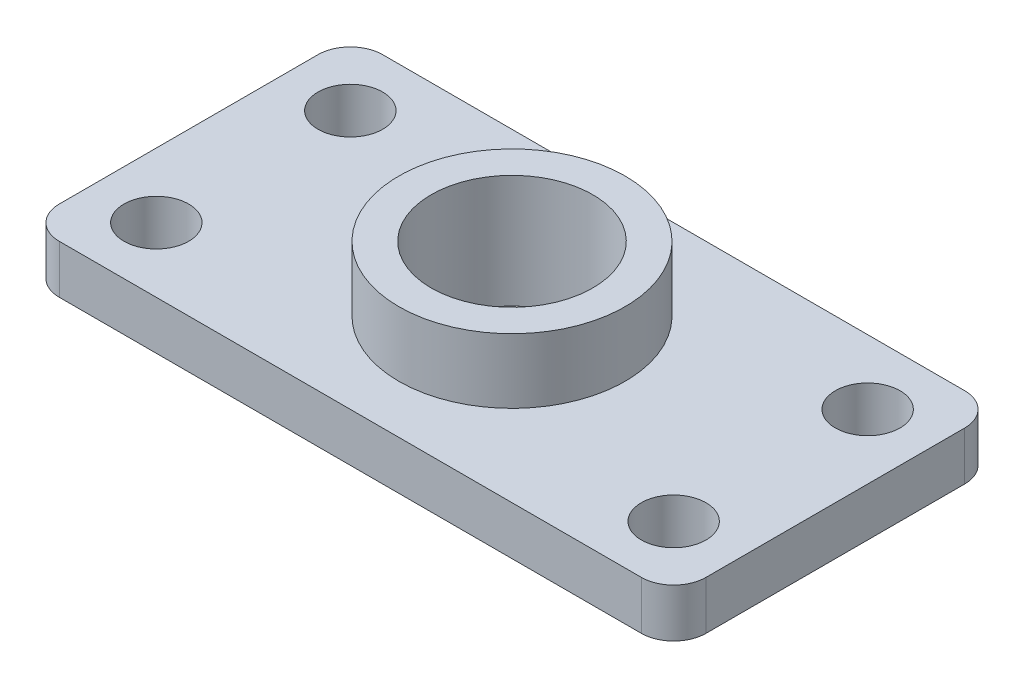
ISO-10303-21;
HEADER;
FILE_DESCRIPTION(('STEP AP214'),'2;1');
FILE_NAME('part.step','',(''),(''),'','','');
FILE_SCHEMA(('AUTOMOTIVE_DESIGN { 1 0 10303 214 1 1 1 1 }'));
ENDSEC;
DATA;
#1=APPLICATION_CONTEXT('core data for automotive mechanical design processes');
#2=APPLICATION_PROTOCOL_DEFINITION('international standard','automotive_design',2000,#1);
#3=PRODUCT_CONTEXT('',#1,'mechanical');
#4=PRODUCT('Part','Part','',(#3));
#5=PRODUCT_RELATED_PRODUCT_CATEGORY('part','',(#4));
#6=PRODUCT_DEFINITION_FORMATION('','',#4);
#7=PRODUCT_DEFINITION_CONTEXT('part definition',#1,'design');
#8=PRODUCT_DEFINITION('design','',#6,#7);
#9=PRODUCT_DEFINITION_SHAPE('','',#8);
#10=(LENGTH_UNIT() NAMED_UNIT(*) SI_UNIT(.MILLI.,.METRE.));
#11=(NAMED_UNIT(*) PLANE_ANGLE_UNIT() SI_UNIT($,.RADIAN.));
#12=(NAMED_UNIT(*) SI_UNIT($,.STERADIAN.) SOLID_ANGLE_UNIT());
#13=UNCERTAINTY_MEASURE_WITH_UNIT(LENGTH_MEASURE(1.E-05),#10,'distance_accuracy_value','');
#14=(GEOMETRIC_REPRESENTATION_CONTEXT(3) GLOBAL_UNCERTAINTY_ASSIGNED_CONTEXT((#13)) GLOBAL_UNIT_ASSIGNED_CONTEXT((#10,
#11,#12)) REPRESENTATION_CONTEXT('',''));
#15=CARTESIAN_POINT('',(0.,0.,0.));
#16=DIRECTION('',(0.,0.,1.));
#17=DIRECTION('',(1.,0.,0.));
#18=AXIS2_PLACEMENT_3D('',#15,#16,#17);
#19=CARTESIAN_POINT('',(0.,15.,0.));
#20=DIRECTION('',(0.,0.,-1.));
#21=DIRECTION('',(-1.,0.,0.));
#22=AXIS2_PLACEMENT_3D('',#19,#20,#21);
#23=PLANE('',#22);
#24=DIRECTION('',(1.,0.,0.));
#25=VECTOR('',#24,1.);
#26=CARTESIAN_POINT('',(0.,0.,0.));
#27=LINE('',#26,#25);
#28=CARTESIAN_POINT('',(10.,0.,0.));
#29=VERTEX_POINT('',#28);
#30=CARTESIAN_POINT('',(190.,0.,0.));
#31=VERTEX_POINT('',#30);
#32=EDGE_CURVE('E184',#29,#31,#27,.T.);
#33=ORIENTED_EDGE('',*,*,#32,.T.);
#34=DIRECTION('',(0.,-1.,0.));
#35=VECTOR('',#34,1.);
#36=CARTESIAN_POINT('',(190.,15.,0.));
#37=LINE('',#36,#35);
#38=CARTESIAN_POINT('',(190.,15.,0.));
#39=VERTEX_POINT('',#38);
#40=EDGE_CURVE('E173',#31,#39,#37,.F.);
#41=ORIENTED_EDGE('',*,*,#40,.T.);
#42=DIRECTION('',(1.,0.,0.));
#43=VECTOR('',#42,1.);
#44=CARTESIAN_POINT('',(0.,15.,0.));
#45=LINE('',#44,#43);
#46=CARTESIAN_POINT('',(10.,15.,0.));
#47=VERTEX_POINT('',#46);
#48=EDGE_CURVE('E181',#47,#39,#45,.T.);
#49=ORIENTED_EDGE('',*,*,#48,.F.);
#50=DIRECTION('',(0.,-1.,0.));
#51=VECTOR('',#50,1.);
#52=CARTESIAN_POINT('',(10.,0.,0.));
#53=LINE('',#52,#51);
#54=EDGE_CURVE('E169',#47,#29,#53,.T.);
#55=ORIENTED_EDGE('',*,*,#54,.T.);
#56=EDGE_LOOP('',(#33,#41,#49,#55));
#57=FACE_BOUND('',#56,.T.);
#58=ADVANCED_FACE('F43',(#57),#23,.F.);
#59=CARTESIAN_POINT('',(200.,15.,0.));
#60=DIRECTION('',(-1.,0.,0.));
#61=DIRECTION('',(0.,0.,1.));
#62=AXIS2_PLACEMENT_3D('',#59,#60,#61);
#63=PLANE('',#62);
#64=DIRECTION('',(0.,0.,-1.));
#65=VECTOR('',#64,1.);
#66=CARTESIAN_POINT('',(200.,0.,0.));
#67=LINE('',#66,#65);
#68=CARTESIAN_POINT('',(200.,0.,-10.));
#69=VERTEX_POINT('',#68);
#70=CARTESIAN_POINT('',(200.,0.,-90.));
#71=VERTEX_POINT('',#70);
#72=EDGE_CURVE('E130',#69,#71,#67,.T.);
#73=ORIENTED_EDGE('',*,*,#72,.T.);
#74=DIRECTION('',(0.,-1.,0.));
#75=VECTOR('',#74,1.);
#76=CARTESIAN_POINT('',(200.,15.,-90.));
#77=LINE('',#76,#75);
#78=CARTESIAN_POINT('',(200.,15.,-90.));
#79=VERTEX_POINT('',#78);
#80=EDGE_CURVE('E155',#71,#79,#77,.F.);
#81=ORIENTED_EDGE('',*,*,#80,.T.);
#82=DIRECTION('',(0.,0.,-1.));
#83=VECTOR('',#82,1.);
#84=CARTESIAN_POINT('',(200.,15.,0.));
#85=LINE('',#84,#83);
#86=CARTESIAN_POINT('',(200.,15.,-10.));
#87=VERTEX_POINT('',#86);
#88=EDGE_CURVE('E192',#87,#79,#85,.T.);
#89=ORIENTED_EDGE('',*,*,#88,.F.);
#90=DIRECTION('',(0.,-1.,0.));
#91=VECTOR('',#90,1.);
#92=CARTESIAN_POINT('',(200.,15.,-10.));
#93=LINE('',#92,#91);
#94=EDGE_CURVE('E151',#87,#69,#93,.T.);
#95=ORIENTED_EDGE('',*,*,#94,.T.);
#96=EDGE_LOOP('',(#73,#81,#89,#95));
#97=FACE_BOUND('',#96,.T.);
#98=ADVANCED_FACE('F199',(#97),#63,.F.);
#99=CARTESIAN_POINT('',(0.,15.,-100.));
#100=DIRECTION('',(0.,0.,-1.));
#101=DIRECTION('',(-1.,0.,0.));
#102=AXIS2_PLACEMENT_3D('',#99,#100,#101);
#103=PLANE('',#102);
#104=DIRECTION('',(1.,0.,0.));
#105=VECTOR('',#104,1.);
#106=CARTESIAN_POINT('',(0.,15.,-100.));
#107=LINE('',#106,#105);
#108=CARTESIAN_POINT('',(10.,15.,-100.));
#109=VERTEX_POINT('',#108);
#110=CARTESIAN_POINT('',(190.,15.,-100.));
#111=VERTEX_POINT('',#110);
#112=EDGE_CURVE('E209',#109,#111,#107,.T.);
#113=ORIENTED_EDGE('',*,*,#112,.T.);
#114=DIRECTION('',(0.,-1.,0.));
#115=VECTOR('',#114,1.);
#116=CARTESIAN_POINT('',(190.,0.,-100.));
#117=LINE('',#116,#115);
#118=CARTESIAN_POINT('',(190.,0.,-100.));
#119=VERTEX_POINT('',#118);
#120=EDGE_CURVE('E128',#111,#119,#117,.T.);
#121=ORIENTED_EDGE('',*,*,#120,.T.);
#122=DIRECTION('',(1.,0.,0.));
#123=VECTOR('',#122,1.);
#124=CARTESIAN_POINT('',(0.,0.,-100.));
#125=LINE('',#124,#123);
#126=CARTESIAN_POINT('',(10.,0.,-100.));
#127=VERTEX_POINT('',#126);
#128=EDGE_CURVE('E113',#127,#119,#125,.T.);
#129=ORIENTED_EDGE('',*,*,#128,.F.);
#130=DIRECTION('',(0.,-1.,0.));
#131=VECTOR('',#130,1.);
#132=CARTESIAN_POINT('',(10.,15.,-100.));
#133=LINE('',#132,#131);
#134=EDGE_CURVE('E126',#127,#109,#133,.F.);
#135=ORIENTED_EDGE('',*,*,#134,.T.);
#136=EDGE_LOOP('',(#113,#121,#129,#135));
#137=FACE_BOUND('',#136,.T.);
#138=ADVANCED_FACE('F125',(#137),#103,.T.);
#139=CARTESIAN_POINT('',(0.,15.,0.));
#140=DIRECTION('',(-1.,0.,0.));
#141=DIRECTION('',(0.,0.,1.));
#142=AXIS2_PLACEMENT_3D('',#139,#140,#141);
#143=PLANE('',#142);
#144=DIRECTION('',(0.,0.,-1.));
#145=VECTOR('',#144,1.);
#146=CARTESIAN_POINT('',(0.,15.,0.));
#147=LINE('',#146,#145);
#148=CARTESIAN_POINT('',(0.,15.,-10.));
#149=VERTEX_POINT('',#148);
#150=CARTESIAN_POINT('',(0.,15.,-90.));
#151=VERTEX_POINT('',#150);
#152=EDGE_CURVE('E140',#149,#151,#147,.T.);
#153=ORIENTED_EDGE('',*,*,#152,.T.);
#154=DIRECTION('',(0.,-1.,0.));
#155=VECTOR('',#154,1.);
#156=CARTESIAN_POINT('',(0.,15.,-90.));
#157=LINE('',#156,#155);
#158=CARTESIAN_POINT('',(0.,0.,-90.));
#159=VERTEX_POINT('',#158);
#160=EDGE_CURVE('E11',#151,#159,#157,.T.);
#161=ORIENTED_EDGE('',*,*,#160,.T.);
#162=DIRECTION('',(0.,0.,-1.));
#163=VECTOR('',#162,1.);
#164=CARTESIAN_POINT('',(0.,0.,0.));
#165=LINE('',#164,#163);
#166=CARTESIAN_POINT('',(0.,0.,-10.));
#167=VERTEX_POINT('',#166);
#168=EDGE_CURVE('E114',#167,#159,#165,.T.);
#169=ORIENTED_EDGE('',*,*,#168,.F.);
#170=DIRECTION('',(0.,-1.,0.));
#171=VECTOR('',#170,1.);
#172=CARTESIAN_POINT('',(0.,15.,-10.));
#173=LINE('',#172,#171);
#174=EDGE_CURVE('E52',#167,#149,#173,.F.);
#175=ORIENTED_EDGE('',*,*,#174,.T.);
#176=EDGE_LOOP('',(#153,#161,#169,#175));
#177=FACE_BOUND('',#176,.T.);
#178=ADVANCED_FACE('F262',(#177),#143,.T.);
#179=CARTESIAN_POINT('',(0.,15.,0.));
#180=DIRECTION('',(0.,1.,0.));
#181=DIRECTION('',(0.,0.,1.));
#182=AXIS2_PLACEMENT_3D('',#179,#180,#181);
#183=PLANE('',#182);
#184=CARTESIAN_POINT('',(180.,15.,-20.));
#185=DIRECTION('',(0.,1.,0.));
#186=DIRECTION('',(0.,0.,1.));
#187=AXIS2_PLACEMENT_3D('',#184,#185,#186);
#188=CIRCLE('',#187,10.);
#189=CARTESIAN_POINT('',(180.,15.,-9.99999999999999));
#190=VERTEX_POINT('',#189);
#191=EDGE_CURVE('E238',#190,#190,#188,.T.);
#192=ORIENTED_EDGE('',*,*,#191,.F.);
#193=EDGE_LOOP('',(#192));
#194=FACE_BOUND('',#193,.T.);
#195=CARTESIAN_POINT('',(180.,15.,-80.));
#196=DIRECTION('',(0.,1.,0.));
#197=DIRECTION('',(0.,0.,1.));
#198=AXIS2_PLACEMENT_3D('',#195,#196,#197);
#199=CIRCLE('',#198,10.);
#200=CARTESIAN_POINT('',(180.,15.,-70.));
#201=VERTEX_POINT('',#200);
#202=EDGE_CURVE('E246',#201,#201,#199,.T.);
#203=ORIENTED_EDGE('',*,*,#202,.F.);
#204=EDGE_LOOP('',(#203));
#205=FACE_BOUND('',#204,.T.);
#206=CARTESIAN_POINT('',(20.,15.,-80.));
#207=DIRECTION('',(0.,1.,0.));
#208=DIRECTION('',(0.,0.,1.));
#209=AXIS2_PLACEMENT_3D('',#206,#207,#208);
#210=CIRCLE('',#209,10.);
#211=CARTESIAN_POINT('',(20.,15.,-70.));
#212=VERTEX_POINT('',#211);
#213=EDGE_CURVE('E230',#212,#212,#210,.T.);
#214=ORIENTED_EDGE('',*,*,#213,.F.);
#215=EDGE_LOOP('',(#214));
#216=FACE_BOUND('',#215,.T.);
#217=CARTESIAN_POINT('',(20.,15.,-20.));
#218=DIRECTION('',(0.,1.,0.));
#219=DIRECTION('',(0.,0.,1.));
#220=AXIS2_PLACEMENT_3D('',#217,#218,#219);
#221=CIRCLE('',#220,10.);
#222=CARTESIAN_POINT('',(20.,15.,-9.99999999999999));
#223=VERTEX_POINT('',#222);
#224=EDGE_CURVE('E226',#223,#223,#221,.T.);
#225=ORIENTED_EDGE('',*,*,#224,.F.);
#226=EDGE_LOOP('',(#225));
#227=FACE_BOUND('',#226,.T.);
#228=CARTESIAN_POINT('',(100.,15.,-50.));
#229=DIRECTION('',(0.,1.,0.));
#230=DIRECTION('',(0.,0.,1.));
#231=AXIS2_PLACEMENT_3D('',#228,#229,#230);
#232=CIRCLE('',#231,35.);
#233=CARTESIAN_POINT('',(100.,15.,-15.));
#234=VERTEX_POINT('',#233);
#235=EDGE_CURVE('E134',#234,#234,#232,.T.);
#236=ORIENTED_EDGE('',*,*,#235,.F.);
#237=EDGE_LOOP('',(#236));
#238=FACE_BOUND('',#237,.T.);
#239=ORIENTED_EDGE('',*,*,#88,.T.);
#240=CARTESIAN_POINT('',(190.,15.,-90.));
#241=DIRECTION('',(0.,1.,0.));
#242=DIRECTION('',(0.,0.,1.));
#243=AXIS2_PLACEMENT_3D('',#240,#241,#242);
#244=CIRCLE('',#243,10.);
#245=EDGE_CURVE('E166',#79,#111,#244,.T.);
#246=ORIENTED_EDGE('',*,*,#245,.T.);
#247=ORIENTED_EDGE('',*,*,#112,.F.);
#248=CARTESIAN_POINT('',(10.,15.,-90.));
#249=DIRECTION('',(0.,1.,0.));
#250=DIRECTION('',(0.,0.,1.));
#251=AXIS2_PLACEMENT_3D('',#248,#249,#250);
#252=CIRCLE('',#251,10.);
#253=EDGE_CURVE('E59',#109,#151,#252,.T.);
#254=ORIENTED_EDGE('',*,*,#253,.T.);
#255=ORIENTED_EDGE('',*,*,#152,.F.);
#256=CARTESIAN_POINT('',(10.,15.,-10.));
#257=DIRECTION('',(0.,1.,0.));
#258=DIRECTION('',(0.,0.,1.));
#259=AXIS2_PLACEMENT_3D('',#256,#257,#258);
#260=CIRCLE('',#259,10.);
#261=EDGE_CURVE('E158',#149,#47,#260,.T.);
#262=ORIENTED_EDGE('',*,*,#261,.T.);
#263=ORIENTED_EDGE('',*,*,#48,.T.);
#264=CARTESIAN_POINT('',(190.,15.,-10.));
#265=DIRECTION('',(0.,1.,0.));
#266=DIRECTION('',(0.,0.,1.));
#267=AXIS2_PLACEMENT_3D('',#264,#265,#266);
#268=CIRCLE('',#267,10.);
#269=EDGE_CURVE('E163',#39,#87,#268,.T.);
#270=ORIENTED_EDGE('',*,*,#269,.T.);
#271=EDGE_LOOP('',(#239,#246,#247,#254,#255,#262,#263,#270));
#272=FACE_BOUND('',#271,.T.);
#273=ADVANCED_FACE('F188',(#194,#205,#216,#227,#238,#272),#183,.T.);
#274=CARTESIAN_POINT('',(0.,0.,0.));
#275=DIRECTION('',(0.,1.,0.));
#276=DIRECTION('',(0.,0.,1.));
#277=AXIS2_PLACEMENT_3D('',#274,#275,#276);
#278=PLANE('',#277);
#279=CARTESIAN_POINT('',(180.,0.,-20.));
#280=DIRECTION('',(0.,1.,0.));
#281=DIRECTION('',(0.,0.,1.));
#282=AXIS2_PLACEMENT_3D('',#279,#280,#281);
#283=CIRCLE('',#282,10.);
#284=CARTESIAN_POINT('',(180.,0.,-9.99999999999999));
#285=VERTEX_POINT('',#284);
#286=EDGE_CURVE('E234',#285,#285,#283,.T.);
#287=ORIENTED_EDGE('',*,*,#286,.T.);
#288=EDGE_LOOP('',(#287));
#289=FACE_BOUND('',#288,.T.);
#290=CARTESIAN_POINT('',(180.,0.,-80.));
#291=DIRECTION('',(0.,1.,0.));
#292=DIRECTION('',(0.,0.,1.));
#293=AXIS2_PLACEMENT_3D('',#290,#291,#292);
#294=CIRCLE('',#293,10.);
#295=CARTESIAN_POINT('',(180.,0.,-70.));
#296=VERTEX_POINT('',#295);
#297=EDGE_CURVE('E242',#296,#296,#294,.T.);
#298=ORIENTED_EDGE('',*,*,#297,.T.);
#299=EDGE_LOOP('',(#298));
#300=FACE_BOUND('',#299,.T.);
#301=CARTESIAN_POINT('',(20.,0.,-80.));
#302=DIRECTION('',(0.,1.,0.));
#303=DIRECTION('',(0.,0.,1.));
#304=AXIS2_PLACEMENT_3D('',#301,#302,#303);
#305=CIRCLE('',#304,10.);
#306=CARTESIAN_POINT('',(20.,0.,-70.));
#307=VERTEX_POINT('',#306);
#308=EDGE_CURVE('E250',#307,#307,#305,.T.);
#309=ORIENTED_EDGE('',*,*,#308,.T.);
#310=EDGE_LOOP('',(#309));
#311=FACE_BOUND('',#310,.T.);
#312=CARTESIAN_POINT('',(20.,0.,-20.));
#313=DIRECTION('',(0.,1.,0.));
#314=DIRECTION('',(0.,0.,1.));
#315=AXIS2_PLACEMENT_3D('',#312,#313,#314);
#316=CIRCLE('',#315,10.);
#317=CARTESIAN_POINT('',(20.,0.,-9.99999999999999));
#318=VERTEX_POINT('',#317);
#319=EDGE_CURVE('E222',#318,#318,#316,.T.);
#320=ORIENTED_EDGE('',*,*,#319,.T.);
#321=EDGE_LOOP('',(#320));
#322=FACE_BOUND('',#321,.T.);
#323=CARTESIAN_POINT('',(100.,0.,-50.));
#324=DIRECTION('',(0.,1.,0.));
#325=DIRECTION('',(0.,0.,1.));
#326=AXIS2_PLACEMENT_3D('',#323,#324,#325);
#327=CIRCLE('',#326,25.);
#328=CARTESIAN_POINT('',(100.,0.,-25.));
#329=VERTEX_POINT('',#328);
#330=EDGE_CURVE('E217',#329,#329,#327,.T.);
#331=ORIENTED_EDGE('',*,*,#330,.T.);
#332=EDGE_LOOP('',(#331));
#333=FACE_BOUND('',#332,.T.);
#334=ORIENTED_EDGE('',*,*,#128,.T.);
#335=CARTESIAN_POINT('',(190.,0.,-90.));
#336=DIRECTION('',(0.,1.,0.));
#337=DIRECTION('',(0.,0.,1.));
#338=AXIS2_PLACEMENT_3D('',#335,#336,#337);
#339=CIRCLE('',#338,10.);
#340=EDGE_CURVE('E148',#119,#71,#339,.F.);
#341=ORIENTED_EDGE('',*,*,#340,.T.);
#342=ORIENTED_EDGE('',*,*,#72,.F.);
#343=CARTESIAN_POINT('',(190.,0.,-10.));
#344=DIRECTION('',(0.,1.,0.));
#345=DIRECTION('',(0.,0.,1.));
#346=AXIS2_PLACEMENT_3D('',#343,#344,#345);
#347=CIRCLE('',#346,10.);
#348=EDGE_CURVE('E119',#69,#31,#347,.F.);
#349=ORIENTED_EDGE('',*,*,#348,.T.);
#350=ORIENTED_EDGE('',*,*,#32,.F.);
#351=CARTESIAN_POINT('',(10.,0.,-10.));
#352=DIRECTION('',(0.,1.,0.));
#353=DIRECTION('',(0.,0.,1.));
#354=AXIS2_PLACEMENT_3D('',#351,#352,#353);
#355=CIRCLE('',#354,10.);
#356=EDGE_CURVE('E120',#29,#167,#355,.F.);
#357=ORIENTED_EDGE('',*,*,#356,.T.);
#358=ORIENTED_EDGE('',*,*,#168,.T.);
#359=CARTESIAN_POINT('',(10.,0.,-90.));
#360=DIRECTION('',(0.,1.,0.));
#361=DIRECTION('',(0.,0.,1.));
#362=AXIS2_PLACEMENT_3D('',#359,#360,#361);
#363=CIRCLE('',#362,10.);
#364=EDGE_CURVE('E110',#159,#127,#363,.F.);
#365=ORIENTED_EDGE('',*,*,#364,.T.);
#366=EDGE_LOOP('',(#334,#341,#342,#349,#350,#357,#358,#365));
#367=FACE_BOUND('',#366,.T.);
#368=ADVANCED_FACE('F112',(#289,#300,#311,#322,#333,#367),#278,.F.);
#369=CARTESIAN_POINT('',(100.,35.,-50.));
#370=DIRECTION('',(0.,-1.,0.));
#371=DIRECTION('',(0.,0.,-1.));
#372=AXIS2_PLACEMENT_3D('',#369,#370,#371);
#373=CYLINDRICAL_SURFACE('',#372,35.);
#374=CARTESIAN_POINT('',(100.,35.,-50.));
#375=DIRECTION('',(0.,1.,0.));
#376=DIRECTION('',(0.,0.,1.));
#377=AXIS2_PLACEMENT_3D('',#374,#375,#376);
#378=CIRCLE('',#377,35.);
#379=CARTESIAN_POINT('',(100.,35.,-15.));
#380=VERTEX_POINT('',#379);
#381=EDGE_CURVE('E204',#380,#380,#378,.T.);
#382=ORIENTED_EDGE('',*,*,#381,.F.);
#383=EDGE_LOOP('',(#382));
#384=FACE_BOUND('',#383,.T.);
#385=ORIENTED_EDGE('',*,*,#235,.T.);
#386=EDGE_LOOP('',(#385));
#387=FACE_BOUND('',#386,.T.);
#388=ADVANCED_FACE('F269',(#384,#387),#373,.T.);
#389=CARTESIAN_POINT('',(100.,35.,-50.));
#390=DIRECTION('',(0.,1.,0.));
#391=DIRECTION('',(0.,0.,1.));
#392=AXIS2_PLACEMENT_3D('',#389,#390,#391);
#393=PLANE('',#392);
#394=CARTESIAN_POINT('',(100.,35.,-50.));
#395=DIRECTION('',(0.,1.,0.));
#396=DIRECTION('',(0.,0.,1.));
#397=AXIS2_PLACEMENT_3D('',#394,#395,#396);
#398=CIRCLE('',#397,25.);
#399=CARTESIAN_POINT('',(100.,35.,-25.));
#400=VERTEX_POINT('',#399);
#401=EDGE_CURVE('E218',#400,#400,#398,.T.);
#402=ORIENTED_EDGE('',*,*,#401,.F.);
#403=EDGE_LOOP('',(#402));
#404=FACE_BOUND('',#403,.T.);
#405=ORIENTED_EDGE('',*,*,#381,.T.);
#406=EDGE_LOOP('',(#405));
#407=FACE_BOUND('',#406,.T.);
#408=ADVANCED_FACE('F271',(#404,#407),#393,.T.);
#409=CARTESIAN_POINT('',(100.,0.,-50.));
#410=DIRECTION('',(0.,1.,0.));
#411=DIRECTION('',(0.,0.,1.));
#412=AXIS2_PLACEMENT_3D('',#409,#410,#411);
#413=CYLINDRICAL_SURFACE('',#412,25.);
#414=ORIENTED_EDGE('',*,*,#330,.F.);
#415=EDGE_LOOP('',(#414));
#416=FACE_BOUND('',#415,.T.);
#417=ORIENTED_EDGE('',*,*,#401,.T.);
#418=EDGE_LOOP('',(#417));
#419=FACE_BOUND('',#418,.T.);
#420=ADVANCED_FACE('F278',(#416,#419),#413,.F.);
#421=CARTESIAN_POINT('',(20.,0.,-20.));
#422=DIRECTION('',(0.,1.,0.));
#423=DIRECTION('',(0.,0.,1.));
#424=AXIS2_PLACEMENT_3D('',#421,#422,#423);
#425=CYLINDRICAL_SURFACE('',#424,10.);
#426=ORIENTED_EDGE('',*,*,#319,.F.);
#427=EDGE_LOOP('',(#426));
#428=FACE_BOUND('',#427,.T.);
#429=ORIENTED_EDGE('',*,*,#224,.T.);
#430=EDGE_LOOP('',(#429));
#431=FACE_BOUND('',#430,.T.);
#432=ADVANCED_FACE('F354',(#428,#431),#425,.F.);
#433=CARTESIAN_POINT('',(20.,0.,-80.));
#434=DIRECTION('',(0.,1.,0.));
#435=DIRECTION('',(0.,0.,1.));
#436=AXIS2_PLACEMENT_3D('',#433,#434,#435);
#437=CYLINDRICAL_SURFACE('',#436,10.);
#438=ORIENTED_EDGE('',*,*,#308,.F.);
#439=EDGE_LOOP('',(#438));
#440=FACE_BOUND('',#439,.T.);
#441=ORIENTED_EDGE('',*,*,#213,.T.);
#442=EDGE_LOOP('',(#441));
#443=FACE_BOUND('',#442,.T.);
#444=ADVANCED_FACE('F258',(#440,#443),#437,.F.);
#445=CARTESIAN_POINT('',(180.,0.,-80.));
#446=DIRECTION('',(0.,1.,0.));
#447=DIRECTION('',(0.,0.,1.));
#448=AXIS2_PLACEMENT_3D('',#445,#446,#447);
#449=CYLINDRICAL_SURFACE('',#448,10.);
#450=ORIENTED_EDGE('',*,*,#297,.F.);
#451=EDGE_LOOP('',(#450));
#452=FACE_BOUND('',#451,.T.);
#453=ORIENTED_EDGE('',*,*,#202,.T.);
#454=EDGE_LOOP('',(#453));
#455=FACE_BOUND('',#454,.T.);
#456=ADVANCED_FACE('F332',(#452,#455),#449,.F.);
#457=CARTESIAN_POINT('',(180.,0.,-20.));
#458=DIRECTION('',(0.,1.,0.));
#459=DIRECTION('',(0.,0.,1.));
#460=AXIS2_PLACEMENT_3D('',#457,#458,#459);
#461=CYLINDRICAL_SURFACE('',#460,10.);
#462=ORIENTED_EDGE('',*,*,#286,.F.);
#463=EDGE_LOOP('',(#462));
#464=FACE_BOUND('',#463,.T.);
#465=ORIENTED_EDGE('',*,*,#191,.T.);
#466=EDGE_LOOP('',(#465));
#467=FACE_BOUND('',#466,.T.);
#468=ADVANCED_FACE('F295',(#464,#467),#461,.F.);
#469=CARTESIAN_POINT('',(190.,15.,-90.));
#470=DIRECTION('',(0.,1.,0.));
#471=DIRECTION('',(0.,0.,1.));
#472=AXIS2_PLACEMENT_3D('',#469,#470,#471);
#473=CYLINDRICAL_SURFACE('',#472,10.);
#474=ORIENTED_EDGE('',*,*,#245,.F.);
#475=ORIENTED_EDGE('',*,*,#80,.F.);
#476=ORIENTED_EDGE('',*,*,#340,.F.);
#477=ORIENTED_EDGE('',*,*,#120,.F.);
#478=EDGE_LOOP('',(#474,#475,#476,#477));
#479=FACE_BOUND('',#478,.T.);
#480=ADVANCED_FACE('F292',(#479),#473,.T.);
#481=CARTESIAN_POINT('',(190.,15.,-10.));
#482=DIRECTION('',(0.,-1.,0.));
#483=DIRECTION('',(0.,0.,-1.));
#484=AXIS2_PLACEMENT_3D('',#481,#482,#483);
#485=CYLINDRICAL_SURFACE('',#484,10.);
#486=ORIENTED_EDGE('',*,*,#269,.F.);
#487=ORIENTED_EDGE('',*,*,#40,.F.);
#488=ORIENTED_EDGE('',*,*,#348,.F.);
#489=ORIENTED_EDGE('',*,*,#94,.F.);
#490=EDGE_LOOP('',(#486,#487,#488,#489));
#491=FACE_BOUND('',#490,.T.);
#492=ADVANCED_FACE('F195',(#491),#485,.T.);
#493=CARTESIAN_POINT('',(10.,15.,-90.));
#494=DIRECTION('',(0.,-1.,0.));
#495=DIRECTION('',(0.,0.,-1.));
#496=AXIS2_PLACEMENT_3D('',#493,#494,#495);
#497=CYLINDRICAL_SURFACE('',#496,10.);
#498=ORIENTED_EDGE('',*,*,#253,.F.);
#499=ORIENTED_EDGE('',*,*,#134,.F.);
#500=ORIENTED_EDGE('',*,*,#364,.F.);
#501=ORIENTED_EDGE('',*,*,#160,.F.);
#502=EDGE_LOOP('',(#498,#499,#500,#501));
#503=FACE_BOUND('',#502,.T.);
#504=ADVANCED_FACE('F132',(#503),#497,.T.);
#505=CARTESIAN_POINT('',(10.,15.,-10.));
#506=DIRECTION('',(0.,1.,0.));
#507=DIRECTION('',(0.,0.,1.));
#508=AXIS2_PLACEMENT_3D('',#505,#506,#507);
#509=CYLINDRICAL_SURFACE('',#508,10.);
#510=ORIENTED_EDGE('',*,*,#261,.F.);
#511=ORIENTED_EDGE('',*,*,#174,.F.);
#512=ORIENTED_EDGE('',*,*,#356,.F.);
#513=ORIENTED_EDGE('',*,*,#54,.F.);
#514=EDGE_LOOP('',(#510,#511,#512,#513));
#515=FACE_BOUND('',#514,.T.);
#516=ADVANCED_FACE('F45',(#515),#509,.T.);
#517=CLOSED_SHELL('',(#58,#98,#138,#178,#273,#368,#388,#408,#420,#432,#444,#456,#468,#480,#492,
#504,#516));
#518=MANIFOLD_SOLID_BREP('B2',#517);
#519=ADVANCED_BREP_SHAPE_REPRESENTATION('',(#18,#518),#14);
#520=SHAPE_DEFINITION_REPRESENTATION(#9,#519);
ENDSEC;
END-ISO-10303-21;
